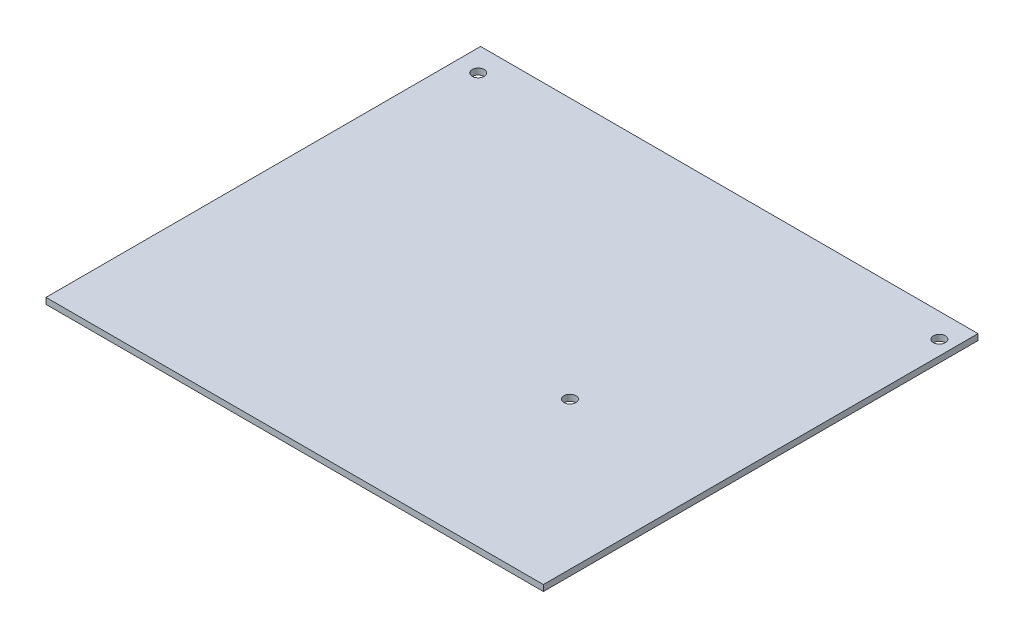
ISO-10303-21;
HEADER;
FILE_DESCRIPTION(('STEP AP214'),'2;1');
FILE_NAME('part.step','',(''),(''),'','','');
FILE_SCHEMA(('AUTOMOTIVE_DESIGN { 1 0 10303 214 1 1 1 1 }'));
ENDSEC;
DATA;
#1=APPLICATION_CONTEXT('core data for automotive mechanical design processes');
#2=APPLICATION_PROTOCOL_DEFINITION('international standard','automotive_design',2000,#1);
#3=PRODUCT_CONTEXT('',#1,'mechanical');
#4=PRODUCT('Part','Part','',(#3));
#5=PRODUCT_RELATED_PRODUCT_CATEGORY('part','',(#4));
#6=PRODUCT_DEFINITION_FORMATION('','',#4);
#7=PRODUCT_DEFINITION_CONTEXT('part definition',#1,'design');
#8=PRODUCT_DEFINITION('design','',#6,#7);
#9=PRODUCT_DEFINITION_SHAPE('','',#8);
#10=(LENGTH_UNIT() NAMED_UNIT(*) SI_UNIT(.MILLI.,.METRE.));
#11=(NAMED_UNIT(*) PLANE_ANGLE_UNIT() SI_UNIT($,.RADIAN.));
#12=(NAMED_UNIT(*) SI_UNIT($,.STERADIAN.) SOLID_ANGLE_UNIT());
#13=UNCERTAINTY_MEASURE_WITH_UNIT(LENGTH_MEASURE(1.E-05),#10,'distance_accuracy_value','');
#14=(GEOMETRIC_REPRESENTATION_CONTEXT(3) GLOBAL_UNCERTAINTY_ASSIGNED_CONTEXT((#13)) GLOBAL_UNIT_ASSIGNED_CONTEXT((#10,
#11,#12)) REPRESENTATION_CONTEXT('',''));
#15=CARTESIAN_POINT('',(0.,0.,0.));
#16=DIRECTION('',(0.,0.,1.));
#17=DIRECTION('',(1.,0.,0.));
#18=AXIS2_PLACEMENT_3D('',#15,#16,#17);
#19=CARTESIAN_POINT('',(0.,1.6,0.));
#20=DIRECTION('',(0.,-1.,0.));
#21=DIRECTION('',(0.,0.,-1.));
#22=AXIS2_PLACEMENT_3D('',#19,#20,#21);
#23=PLANE('',#22);
#24=DIRECTION('',(0.,0.,-1.));
#25=VECTOR('',#24,1.);
#26=CARTESIAN_POINT('',(65.405,1.6,57.15));
#27=LINE('',#26,#25);
#28=CARTESIAN_POINT('',(65.405,1.6,57.15));
#29=VERTEX_POINT('',#28);
#30=CARTESIAN_POINT('',(65.405,1.6,-57.15));
#31=VERTEX_POINT('',#30);
#32=EDGE_CURVE('E88',#29,#31,#27,.T.);
#33=ORIENTED_EDGE('',*,*,#32,.T.);
#34=DIRECTION('',(-1.,0.,0.));
#35=VECTOR('',#34,1.);
#36=CARTESIAN_POINT('',(-65.405,1.6,-57.15));
#37=LINE('',#36,#35);
#38=CARTESIAN_POINT('',(-65.405,1.6,-57.15));
#39=VERTEX_POINT('',#38);
#40=EDGE_CURVE('E83',#31,#39,#37,.T.);
#41=ORIENTED_EDGE('',*,*,#40,.T.);
#42=DIRECTION('',(0.,0.,1.));
#43=VECTOR('',#42,1.);
#44=CARTESIAN_POINT('',(-65.405,1.6,57.15));
#45=LINE('',#44,#43);
#46=CARTESIAN_POINT('',(-65.405,1.6,57.15));
#47=VERTEX_POINT('',#46);
#48=EDGE_CURVE('E86',#39,#47,#45,.T.);
#49=ORIENTED_EDGE('',*,*,#48,.T.);
#50=DIRECTION('',(1.,0.,0.));
#51=VECTOR('',#50,1.);
#52=CARTESIAN_POINT('',(-65.405,1.6,57.15));
#53=LINE('',#52,#51);
#54=EDGE_CURVE('E53',#47,#29,#53,.T.);
#55=ORIENTED_EDGE('',*,*,#54,.T.);
#56=EDGE_LOOP('',(#33,#41,#49,#55));
#57=FACE_BOUND('',#56,.T.);
#58=CARTESIAN_POINT('',(61.595,1.6,-50.8));
#59=DIRECTION('',(0.,1.,0.));
#60=DIRECTION('',(0.,0.,1.));
#61=AXIS2_PLACEMENT_3D('',#58,#59,#60);
#62=CIRCLE('',#61,1.5748);
#63=CARTESIAN_POINT('',(61.595,1.6,-49.2252));
#64=VERTEX_POINT('',#63);
#65=EDGE_CURVE('E103',#64,#64,#62,.T.);
#66=ORIENTED_EDGE('',*,*,#65,.F.);
#67=EDGE_LOOP('',(#66));
#68=FACE_BOUND('',#67,.T.);
#69=CARTESIAN_POINT('',(26.67,1.6,11.43));
#70=DIRECTION('',(0.,1.,0.));
#71=DIRECTION('',(0.,0.,1.));
#72=AXIS2_PLACEMENT_3D('',#69,#70,#71);
#73=CIRCLE('',#72,1.5748);
#74=CARTESIAN_POINT('',(26.67,1.6,13.0048));
#75=VERTEX_POINT('',#74);
#76=EDGE_CURVE('E118',#75,#75,#73,.T.);
#77=ORIENTED_EDGE('',*,*,#76,.F.);
#78=EDGE_LOOP('',(#77));
#79=FACE_BOUND('',#78,.T.);
#80=CARTESIAN_POINT('',(-59.69,1.6,-50.8));
#81=DIRECTION('',(0.,1.,0.));
#82=DIRECTION('',(0.,0.,-1.));
#83=AXIS2_PLACEMENT_3D('',#80,#81,#82);
#84=CIRCLE('',#83,1.5748);
#85=CARTESIAN_POINT('',(-59.69,1.6,-52.3748));
#86=VERTEX_POINT('',#85);
#87=EDGE_CURVE('E124',#86,#86,#84,.T.);
#88=ORIENTED_EDGE('',*,*,#87,.F.);
#89=EDGE_LOOP('',(#88));
#90=FACE_BOUND('',#89,.T.);
#91=ADVANCED_FACE('F36',(#57,#68,#79,#90),#23,.F.);
#92=CARTESIAN_POINT('',(0.,0.,0.));
#93=DIRECTION('',(0.,-1.,0.));
#94=DIRECTION('',(0.,0.,-1.));
#95=AXIS2_PLACEMENT_3D('',#92,#93,#94);
#96=PLANE('',#95);
#97=CARTESIAN_POINT('',(26.67,0.,11.43));
#98=DIRECTION('',(0.,1.,0.));
#99=DIRECTION('',(0.,0.,1.));
#100=AXIS2_PLACEMENT_3D('',#97,#98,#99);
#101=CIRCLE('',#100,1.5748);
#102=CARTESIAN_POINT('',(26.67,0.,13.0048));
#103=VERTEX_POINT('',#102);
#104=EDGE_CURVE('E121',#103,#103,#101,.T.);
#105=ORIENTED_EDGE('',*,*,#104,.T.);
#106=EDGE_LOOP('',(#105));
#107=FACE_BOUND('',#106,.T.);
#108=DIRECTION('',(0.,0.,-1.));
#109=VECTOR('',#108,1.);
#110=CARTESIAN_POINT('',(65.405,0.,57.15));
#111=LINE('',#110,#109);
#112=CARTESIAN_POINT('',(65.405,0.,57.15));
#113=VERTEX_POINT('',#112);
#114=CARTESIAN_POINT('',(65.405,0.,-57.15));
#115=VERTEX_POINT('',#114);
#116=EDGE_CURVE('E100',#113,#115,#111,.T.);
#117=ORIENTED_EDGE('',*,*,#116,.F.);
#118=DIRECTION('',(1.,0.,0.));
#119=VECTOR('',#118,1.);
#120=CARTESIAN_POINT('',(-65.405,0.,57.15));
#121=LINE('',#120,#119);
#122=CARTESIAN_POINT('',(-65.405,0.,57.15));
#123=VERTEX_POINT('',#122);
#124=EDGE_CURVE('E76',#123,#113,#121,.T.);
#125=ORIENTED_EDGE('',*,*,#124,.F.);
#126=DIRECTION('',(0.,0.,1.));
#127=VECTOR('',#126,1.);
#128=CARTESIAN_POINT('',(-65.405,0.,57.15));
#129=LINE('',#128,#127);
#130=CARTESIAN_POINT('',(-65.405,0.,-57.15));
#131=VERTEX_POINT('',#130);
#132=EDGE_CURVE('E70',#131,#123,#129,.T.);
#133=ORIENTED_EDGE('',*,*,#132,.F.);
#134=DIRECTION('',(-1.,0.,0.));
#135=VECTOR('',#134,1.);
#136=CARTESIAN_POINT('',(-65.405,0.,-57.15));
#137=LINE('',#136,#135);
#138=EDGE_CURVE('E92',#115,#131,#137,.T.);
#139=ORIENTED_EDGE('',*,*,#138,.F.);
#140=EDGE_LOOP('',(#117,#125,#133,#139));
#141=FACE_BOUND('',#140,.T.);
#142=CARTESIAN_POINT('',(61.595,0.,-50.8));
#143=DIRECTION('',(0.,1.,0.));
#144=DIRECTION('',(0.,0.,1.));
#145=AXIS2_PLACEMENT_3D('',#142,#143,#144);
#146=CIRCLE('',#145,1.5748);
#147=CARTESIAN_POINT('',(61.595,0.,-49.2252));
#148=VERTEX_POINT('',#147);
#149=EDGE_CURVE('E115',#148,#148,#146,.T.);
#150=ORIENTED_EDGE('',*,*,#149,.T.);
#151=EDGE_LOOP('',(#150));
#152=FACE_BOUND('',#151,.T.);
#153=CARTESIAN_POINT('',(-59.69,0.,-50.8));
#154=DIRECTION('',(0.,1.,0.));
#155=DIRECTION('',(0.,0.,-1.));
#156=AXIS2_PLACEMENT_3D('',#153,#154,#155);
#157=CIRCLE('',#156,1.5748);
#158=CARTESIAN_POINT('',(-59.69,0.,-52.3748));
#159=VERTEX_POINT('',#158);
#160=EDGE_CURVE('E127',#159,#159,#157,.T.);
#161=ORIENTED_EDGE('',*,*,#160,.T.);
#162=EDGE_LOOP('',(#161));
#163=FACE_BOUND('',#162,.T.);
#164=ADVANCED_FACE('F111',(#107,#141,#152,#163),#96,.T.);
#165=CARTESIAN_POINT('',(65.405,1.6,57.15));
#166=DIRECTION('',(-1.,0.,0.));
#167=DIRECTION('',(0.,0.,1.));
#168=AXIS2_PLACEMENT_3D('',#165,#166,#167);
#169=PLANE('',#168);
#170=ORIENTED_EDGE('',*,*,#116,.T.);
#171=DIRECTION('',(0.,-1.,0.));
#172=VECTOR('',#171,1.);
#173=CARTESIAN_POINT('',(65.405,1.6,-57.15));
#174=LINE('',#173,#172);
#175=EDGE_CURVE('E11',#31,#115,#174,.T.);
#176=ORIENTED_EDGE('',*,*,#175,.F.);
#177=ORIENTED_EDGE('',*,*,#32,.F.);
#178=DIRECTION('',(0.,-1.,0.));
#179=VECTOR('',#178,1.);
#180=CARTESIAN_POINT('',(65.405,1.6,57.15));
#181=LINE('',#180,#179);
#182=EDGE_CURVE('E96',#29,#113,#181,.T.);
#183=ORIENTED_EDGE('',*,*,#182,.T.);
#184=EDGE_LOOP('',(#170,#176,#177,#183));
#185=FACE_BOUND('',#184,.T.);
#186=ADVANCED_FACE('F38',(#185),#169,.F.);
#187=CARTESIAN_POINT('',(-65.405,1.6,-57.15));
#188=DIRECTION('',(0.,0.,1.));
#189=DIRECTION('',(1.,0.,0.));
#190=AXIS2_PLACEMENT_3D('',#187,#188,#189);
#191=PLANE('',#190);
#192=ORIENTED_EDGE('',*,*,#138,.T.);
#193=DIRECTION('',(0.,-1.,0.));
#194=VECTOR('',#193,1.);
#195=CARTESIAN_POINT('',(-65.405,1.6,-57.15));
#196=LINE('',#195,#194);
#197=EDGE_CURVE('E45',#39,#131,#196,.T.);
#198=ORIENTED_EDGE('',*,*,#197,.F.);
#199=ORIENTED_EDGE('',*,*,#40,.F.);
#200=ORIENTED_EDGE('',*,*,#175,.T.);
#201=EDGE_LOOP('',(#192,#198,#199,#200));
#202=FACE_BOUND('',#201,.T.);
#203=ADVANCED_FACE('F91',(#202),#191,.F.);
#204=CARTESIAN_POINT('',(-65.405,1.6,57.15));
#205=DIRECTION('',(1.,0.,0.));
#206=DIRECTION('',(0.,0.,-1.));
#207=AXIS2_PLACEMENT_3D('',#204,#205,#206);
#208=PLANE('',#207);
#209=ORIENTED_EDGE('',*,*,#132,.T.);
#210=DIRECTION('',(0.,-1.,0.));
#211=VECTOR('',#210,1.);
#212=CARTESIAN_POINT('',(-65.405,1.6,57.15));
#213=LINE('',#212,#211);
#214=EDGE_CURVE('E93',#47,#123,#213,.T.);
#215=ORIENTED_EDGE('',*,*,#214,.F.);
#216=ORIENTED_EDGE('',*,*,#48,.F.);
#217=ORIENTED_EDGE('',*,*,#197,.T.);
#218=EDGE_LOOP('',(#209,#215,#216,#217));
#219=FACE_BOUND('',#218,.T.);
#220=ADVANCED_FACE('F94',(#219),#208,.F.);
#221=CARTESIAN_POINT('',(-65.405,1.6,57.15));
#222=DIRECTION('',(0.,0.,-1.));
#223=DIRECTION('',(-1.,0.,0.));
#224=AXIS2_PLACEMENT_3D('',#221,#222,#223);
#225=PLANE('',#224);
#226=ORIENTED_EDGE('',*,*,#124,.T.);
#227=ORIENTED_EDGE('',*,*,#182,.F.);
#228=ORIENTED_EDGE('',*,*,#54,.F.);
#229=ORIENTED_EDGE('',*,*,#214,.T.);
#230=EDGE_LOOP('',(#226,#227,#228,#229));
#231=FACE_BOUND('',#230,.T.);
#232=ADVANCED_FACE('F108',(#231),#225,.F.);
#233=CARTESIAN_POINT('',(61.595,1.6,-50.8));
#234=DIRECTION('',(0.,-1.,0.));
#235=DIRECTION('',(0.,0.,-1.));
#236=AXIS2_PLACEMENT_3D('',#233,#234,#235);
#237=CYLINDRICAL_SURFACE('',#236,1.5748);
#238=ORIENTED_EDGE('',*,*,#65,.T.);
#239=EDGE_LOOP('',(#238));
#240=FACE_BOUND('',#239,.T.);
#241=ORIENTED_EDGE('',*,*,#149,.F.);
#242=EDGE_LOOP('',(#241));
#243=FACE_BOUND('',#242,.T.);
#244=ADVANCED_FACE('F144',(#240,#243),#237,.F.);
#245=CARTESIAN_POINT('',(26.67,1.6,11.43));
#246=DIRECTION('',(0.,-1.,0.));
#247=DIRECTION('',(0.,0.,-1.));
#248=AXIS2_PLACEMENT_3D('',#245,#246,#247);
#249=CYLINDRICAL_SURFACE('',#248,1.5748);
#250=ORIENTED_EDGE('',*,*,#76,.T.);
#251=EDGE_LOOP('',(#250));
#252=FACE_BOUND('',#251,.T.);
#253=ORIENTED_EDGE('',*,*,#104,.F.);
#254=EDGE_LOOP('',(#253));
#255=FACE_BOUND('',#254,.T.);
#256=ADVANCED_FACE('F190',(#252,#255),#249,.F.);
#257=CARTESIAN_POINT('',(-59.69,1.6,-50.8));
#258=DIRECTION('',(0.,-1.,0.));
#259=DIRECTION('',(0.,0.,-1.));
#260=AXIS2_PLACEMENT_3D('',#257,#258,#259);
#261=CYLINDRICAL_SURFACE('',#260,1.5748);
#262=ORIENTED_EDGE('',*,*,#87,.T.);
#263=EDGE_LOOP('',(#262));
#264=FACE_BOUND('',#263,.T.);
#265=ORIENTED_EDGE('',*,*,#160,.F.);
#266=EDGE_LOOP('',(#265));
#267=FACE_BOUND('',#266,.T.);
#268=ADVANCED_FACE('F133',(#264,#267),#261,.F.);
#269=CLOSED_SHELL('',(#91,#164,#186,#203,#220,#232,#244,#256,#268));
#270=MANIFOLD_SOLID_BREP('B2',#269);
#271=ADVANCED_BREP_SHAPE_REPRESENTATION('',(#18,#270),#14);
#272=SHAPE_DEFINITION_REPRESENTATION(#9,#271);
ENDSEC;
END-ISO-10303-21;
